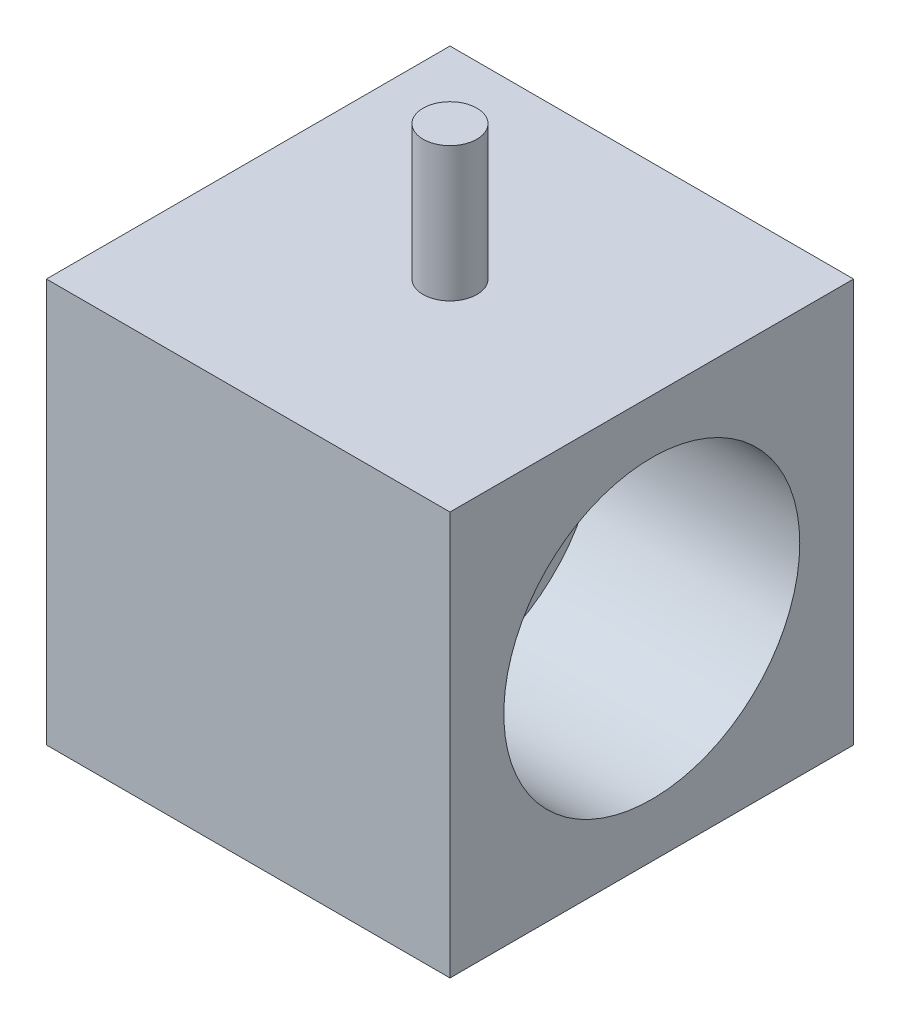
ISO-10303-21;
HEADER;
FILE_DESCRIPTION(('STEP AP214'),'2;1');
FILE_NAME('part.step','',(''),(''),'','','');
FILE_SCHEMA(('AUTOMOTIVE_DESIGN { 1 0 10303 214 1 1 1 1 }'));
ENDSEC;
DATA;
#1=APPLICATION_CONTEXT('core data for automotive mechanical design processes');
#2=APPLICATION_PROTOCOL_DEFINITION('international standard','automotive_design',2000,#1);
#3=PRODUCT_CONTEXT('',#1,'mechanical');
#4=PRODUCT('Part','Part','',(#3));
#5=PRODUCT_RELATED_PRODUCT_CATEGORY('part','',(#4));
#6=PRODUCT_DEFINITION_FORMATION('','',#4);
#7=PRODUCT_DEFINITION_CONTEXT('part definition',#1,'design');
#8=PRODUCT_DEFINITION('design','',#6,#7);
#9=PRODUCT_DEFINITION_SHAPE('','',#8);
#10=(LENGTH_UNIT() NAMED_UNIT(*) SI_UNIT(.MILLI.,.METRE.));
#11=(NAMED_UNIT(*) PLANE_ANGLE_UNIT() SI_UNIT($,.RADIAN.));
#12=(NAMED_UNIT(*) SI_UNIT($,.STERADIAN.) SOLID_ANGLE_UNIT());
#13=UNCERTAINTY_MEASURE_WITH_UNIT(LENGTH_MEASURE(1.E-05),#10,'distance_accuracy_value','');
#14=(GEOMETRIC_REPRESENTATION_CONTEXT(3) GLOBAL_UNCERTAINTY_ASSIGNED_CONTEXT((#13)) GLOBAL_UNIT_ASSIGNED_CONTEXT((#10,
#11,#12)) REPRESENTATION_CONTEXT('',''));
#15=CARTESIAN_POINT('',(0.,0.,0.));
#16=DIRECTION('',(0.,0.,1.));
#17=DIRECTION('',(1.,0.,0.));
#18=AXIS2_PLACEMENT_3D('',#15,#16,#17);
#19=CARTESIAN_POINT('',(15.,30.,-15.));
#20=DIRECTION('',(-1.,0.,0.));
#21=DIRECTION('',(0.,0.,1.));
#22=AXIS2_PLACEMENT_3D('',#19,#20,#21);
#23=PLANE('',#22);
#24=CARTESIAN_POINT('',(15.,15.,0.));
#25=DIRECTION('',(1.,0.,0.));
#26=DIRECTION('',(0.,0.,-1.));
#27=AXIS2_PLACEMENT_3D('',#24,#25,#26);
#28=CIRCLE('',#27,11.);
#29=CARTESIAN_POINT('',(15.,15.,-11.));
#30=VERTEX_POINT('',#29);
#31=EDGE_CURVE('E110',#30,#30,#28,.T.);
#32=ORIENTED_EDGE('',*,*,#31,.F.);
#33=EDGE_LOOP('',(#32));
#34=FACE_BOUND('',#33,.T.);
#35=DIRECTION('',(0.,0.,-1.));
#36=VECTOR('',#35,1.);
#37=CARTESIAN_POINT('',(15.,0.,-15.));
#38=LINE('',#37,#36);
#39=CARTESIAN_POINT('',(15.,0.,15.));
#40=VERTEX_POINT('',#39);
#41=CARTESIAN_POINT('',(15.,0.,-15.));
#42=VERTEX_POINT('',#41);
#43=EDGE_CURVE('E96',#40,#42,#38,.T.);
#44=ORIENTED_EDGE('',*,*,#43,.T.);
#45=DIRECTION('',(0.,-1.,0.));
#46=VECTOR('',#45,1.);
#47=CARTESIAN_POINT('',(15.,30.,-15.));
#48=LINE('',#47,#46);
#49=CARTESIAN_POINT('',(15.,30.,-15.));
#50=VERTEX_POINT('',#49);
#51=EDGE_CURVE('E11',#50,#42,#48,.T.);
#52=ORIENTED_EDGE('',*,*,#51,.F.);
#53=DIRECTION('',(0.,0.,-1.));
#54=VECTOR('',#53,1.);
#55=CARTESIAN_POINT('',(15.,30.,-15.));
#56=LINE('',#55,#54);
#57=CARTESIAN_POINT('',(15.,30.,15.));
#58=VERTEX_POINT('',#57);
#59=EDGE_CURVE('E84',#58,#50,#56,.T.);
#60=ORIENTED_EDGE('',*,*,#59,.F.);
#61=DIRECTION('',(0.,-1.,0.));
#62=VECTOR('',#61,1.);
#63=CARTESIAN_POINT('',(15.,30.,15.));
#64=LINE('',#63,#62);
#65=EDGE_CURVE('E92',#58,#40,#64,.T.);
#66=ORIENTED_EDGE('',*,*,#65,.T.);
#67=EDGE_LOOP('',(#44,#52,#60,#66));
#68=FACE_BOUND('',#67,.T.);
#69=ADVANCED_FACE('F33',(#34,#68),#23,.F.);
#70=CARTESIAN_POINT('',(-15.,30.,-15.));
#71=DIRECTION('',(0.,0.,1.));
#72=DIRECTION('',(1.,0.,0.));
#73=AXIS2_PLACEMENT_3D('',#70,#71,#72);
#74=PLANE('',#73);
#75=DIRECTION('',(-1.,0.,0.));
#76=VECTOR('',#75,1.);
#77=CARTESIAN_POINT('',(-15.,0.,-15.));
#78=LINE('',#77,#76);
#79=CARTESIAN_POINT('',(-15.,0.,-15.));
#80=VERTEX_POINT('',#79);
#81=EDGE_CURVE('E88',#42,#80,#78,.T.);
#82=ORIENTED_EDGE('',*,*,#81,.T.);
#83=DIRECTION('',(0.,-1.,0.));
#84=VECTOR('',#83,1.);
#85=CARTESIAN_POINT('',(-15.,30.,-15.));
#86=LINE('',#85,#84);
#87=CARTESIAN_POINT('',(-15.,30.,-15.));
#88=VERTEX_POINT('',#87);
#89=EDGE_CURVE('E41',#88,#80,#86,.T.);
#90=ORIENTED_EDGE('',*,*,#89,.F.);
#91=DIRECTION('',(-1.,0.,0.));
#92=VECTOR('',#91,1.);
#93=CARTESIAN_POINT('',(-15.,30.,-15.));
#94=LINE('',#93,#92);
#95=EDGE_CURVE('E79',#50,#88,#94,.T.);
#96=ORIENTED_EDGE('',*,*,#95,.F.);
#97=ORIENTED_EDGE('',*,*,#51,.T.);
#98=EDGE_LOOP('',(#82,#90,#96,#97));
#99=FACE_BOUND('',#98,.T.);
#100=ADVANCED_FACE('F87',(#99),#74,.F.);
#101=CARTESIAN_POINT('',(-15.,30.,-15.));
#102=DIRECTION('',(1.,0.,0.));
#103=DIRECTION('',(0.,0.,-1.));
#104=AXIS2_PLACEMENT_3D('',#101,#102,#103);
#105=PLANE('',#104);
#106=DIRECTION('',(0.,0.,1.));
#107=VECTOR('',#106,1.);
#108=CARTESIAN_POINT('',(-15.,0.,-15.));
#109=LINE('',#108,#107);
#110=CARTESIAN_POINT('',(-15.,0.,15.));
#111=VERTEX_POINT('',#110);
#112=EDGE_CURVE('E66',#80,#111,#109,.T.);
#113=ORIENTED_EDGE('',*,*,#112,.T.);
#114=DIRECTION('',(0.,-1.,0.));
#115=VECTOR('',#114,1.);
#116=CARTESIAN_POINT('',(-15.,30.,15.));
#117=LINE('',#116,#115);
#118=CARTESIAN_POINT('',(-15.,30.,15.));
#119=VERTEX_POINT('',#118);
#120=EDGE_CURVE('E89',#119,#111,#117,.T.);
#121=ORIENTED_EDGE('',*,*,#120,.F.);
#122=DIRECTION('',(0.,0.,1.));
#123=VECTOR('',#122,1.);
#124=CARTESIAN_POINT('',(-15.,30.,-15.));
#125=LINE('',#124,#123);
#126=EDGE_CURVE('E82',#88,#119,#125,.T.);
#127=ORIENTED_EDGE('',*,*,#126,.F.);
#128=ORIENTED_EDGE('',*,*,#89,.T.);
#129=EDGE_LOOP('',(#113,#121,#127,#128));
#130=FACE_BOUND('',#129,.T.);
#131=ADVANCED_FACE('F90',(#130),#105,.F.);
#132=CARTESIAN_POINT('',(-15.,30.,15.));
#133=DIRECTION('',(0.,0.,-1.));
#134=DIRECTION('',(-1.,0.,0.));
#135=AXIS2_PLACEMENT_3D('',#132,#133,#134);
#136=PLANE('',#135);
#137=DIRECTION('',(1.,0.,0.));
#138=VECTOR('',#137,1.);
#139=CARTESIAN_POINT('',(-15.,0.,15.));
#140=LINE('',#139,#138);
#141=EDGE_CURVE('E72',#111,#40,#140,.T.);
#142=ORIENTED_EDGE('',*,*,#141,.T.);
#143=ORIENTED_EDGE('',*,*,#65,.F.);
#144=DIRECTION('',(1.,0.,0.));
#145=VECTOR('',#144,1.);
#146=CARTESIAN_POINT('',(-15.,30.,15.));
#147=LINE('',#146,#145);
#148=EDGE_CURVE('E49',#119,#58,#147,.T.);
#149=ORIENTED_EDGE('',*,*,#148,.F.);
#150=ORIENTED_EDGE('',*,*,#120,.T.);
#151=EDGE_LOOP('',(#142,#143,#149,#150));
#152=FACE_BOUND('',#151,.T.);
#153=ADVANCED_FACE('F104',(#152),#136,.F.);
#154=CARTESIAN_POINT('',(0.,30.,0.));
#155=DIRECTION('',(0.,1.,0.));
#156=DIRECTION('',(0.,0.,1.));
#157=AXIS2_PLACEMENT_3D('',#154,#155,#156);
#158=PLANE('',#157);
#159=CARTESIAN_POINT('',(0.,30.,0.));
#160=DIRECTION('',(0.,1.,0.));
#161=DIRECTION('',(0.,0.,1.));
#162=AXIS2_PLACEMENT_3D('',#159,#160,#161);
#163=CIRCLE('',#162,2.);
#164=CARTESIAN_POINT('',(0.,30.,2.));
#165=VERTEX_POINT('',#164);
#166=EDGE_CURVE('E116',#165,#165,#163,.T.);
#167=ORIENTED_EDGE('',*,*,#166,.F.);
#168=EDGE_LOOP('',(#167));
#169=FACE_BOUND('',#168,.T.);
#170=ORIENTED_EDGE('',*,*,#59,.T.);
#171=ORIENTED_EDGE('',*,*,#95,.T.);
#172=ORIENTED_EDGE('',*,*,#126,.T.);
#173=ORIENTED_EDGE('',*,*,#148,.T.);
#174=EDGE_LOOP('',(#170,#171,#172,#173));
#175=FACE_BOUND('',#174,.T.);
#176=ADVANCED_FACE('F80',(#169,#175),#158,.T.);
#177=CARTESIAN_POINT('',(0.,0.,0.));
#178=DIRECTION('',(0.,1.,0.));
#179=DIRECTION('',(0.,0.,1.));
#180=AXIS2_PLACEMENT_3D('',#177,#178,#179);
#181=PLANE('',#180);
#182=ORIENTED_EDGE('',*,*,#43,.F.);
#183=ORIENTED_EDGE('',*,*,#141,.F.);
#184=ORIENTED_EDGE('',*,*,#112,.F.);
#185=ORIENTED_EDGE('',*,*,#81,.F.);
#186=EDGE_LOOP('',(#182,#183,#184,#185));
#187=FACE_BOUND('',#186,.T.);
#188=ADVANCED_FACE('F107',(#187),#181,.F.);
#189=CARTESIAN_POINT('',(0.,15.,0.));
#190=DIRECTION('',(1.,0.,0.));
#191=DIRECTION('',(0.,0.,-1.));
#192=AXIS2_PLACEMENT_3D('',#189,#190,#191);
#193=CYLINDRICAL_SURFACE('',#192,11.);
#194=CARTESIAN_POINT('',(0.,15.,0.));
#195=DIRECTION('',(1.,0.,0.));
#196=DIRECTION('',(0.,0.,-1.));
#197=AXIS2_PLACEMENT_3D('',#194,#195,#196);
#198=CIRCLE('',#197,11.);
#199=CARTESIAN_POINT('',(0.,15.,-11.));
#200=VERTEX_POINT('',#199);
#201=EDGE_CURVE('E99',#200,#200,#198,.T.);
#202=ORIENTED_EDGE('',*,*,#201,.F.);
#203=EDGE_LOOP('',(#202));
#204=FACE_BOUND('',#203,.T.);
#205=ORIENTED_EDGE('',*,*,#31,.T.);
#206=EDGE_LOOP('',(#205));
#207=FACE_BOUND('',#206,.T.);
#208=ADVANCED_FACE('F137',(#204,#207),#193,.F.);
#209=CARTESIAN_POINT('',(0.,15.,0.));
#210=DIRECTION('',(1.,0.,0.));
#211=DIRECTION('',(0.,0.,-1.));
#212=AXIS2_PLACEMENT_3D('',#209,#210,#211);
#213=PLANE('',#212);
#214=ORIENTED_EDGE('',*,*,#201,.T.);
#215=EDGE_LOOP('',(#214));
#216=FACE_BOUND('',#215,.T.);
#217=ADVANCED_FACE('F127',(#216),#213,.T.);
#218=CARTESIAN_POINT('',(0.,40.,0.));
#219=DIRECTION('',(0.,-1.,0.));
#220=DIRECTION('',(0.,0.,-1.));
#221=AXIS2_PLACEMENT_3D('',#218,#219,#220);
#222=CYLINDRICAL_SURFACE('',#221,2.);
#223=CARTESIAN_POINT('',(0.,40.,0.));
#224=DIRECTION('',(0.,1.,0.));
#225=DIRECTION('',(0.,0.,1.));
#226=AXIS2_PLACEMENT_3D('',#223,#224,#225);
#227=CIRCLE('',#226,2.);
#228=CARTESIAN_POINT('',(0.,40.,2.));
#229=VERTEX_POINT('',#228);
#230=EDGE_CURVE('E113',#229,#229,#227,.T.);
#231=ORIENTED_EDGE('',*,*,#230,.F.);
#232=EDGE_LOOP('',(#231));
#233=FACE_BOUND('',#232,.T.);
#234=ORIENTED_EDGE('',*,*,#166,.T.);
#235=EDGE_LOOP('',(#234));
#236=FACE_BOUND('',#235,.T.);
#237=ADVANCED_FACE('F124',(#233,#236),#222,.T.);
#238=CARTESIAN_POINT('',(0.,40.,0.));
#239=DIRECTION('',(0.,1.,0.));
#240=DIRECTION('',(0.,0.,1.));
#241=AXIS2_PLACEMENT_3D('',#238,#239,#240);
#242=PLANE('',#241);
#243=ORIENTED_EDGE('',*,*,#230,.T.);
#244=EDGE_LOOP('',(#243));
#245=FACE_BOUND('',#244,.T.);
#246=ADVANCED_FACE('F122',(#245),#242,.T.);
#247=CLOSED_SHELL('',(#69,#100,#131,#153,#176,#188,#208,#217,#237,#246));
#248=MANIFOLD_SOLID_BREP('B2',#247);
#249=ADVANCED_BREP_SHAPE_REPRESENTATION('',(#18,#248),#14);
#250=SHAPE_DEFINITION_REPRESENTATION(#9,#249);
ENDSEC;
END-ISO-10303-21;
